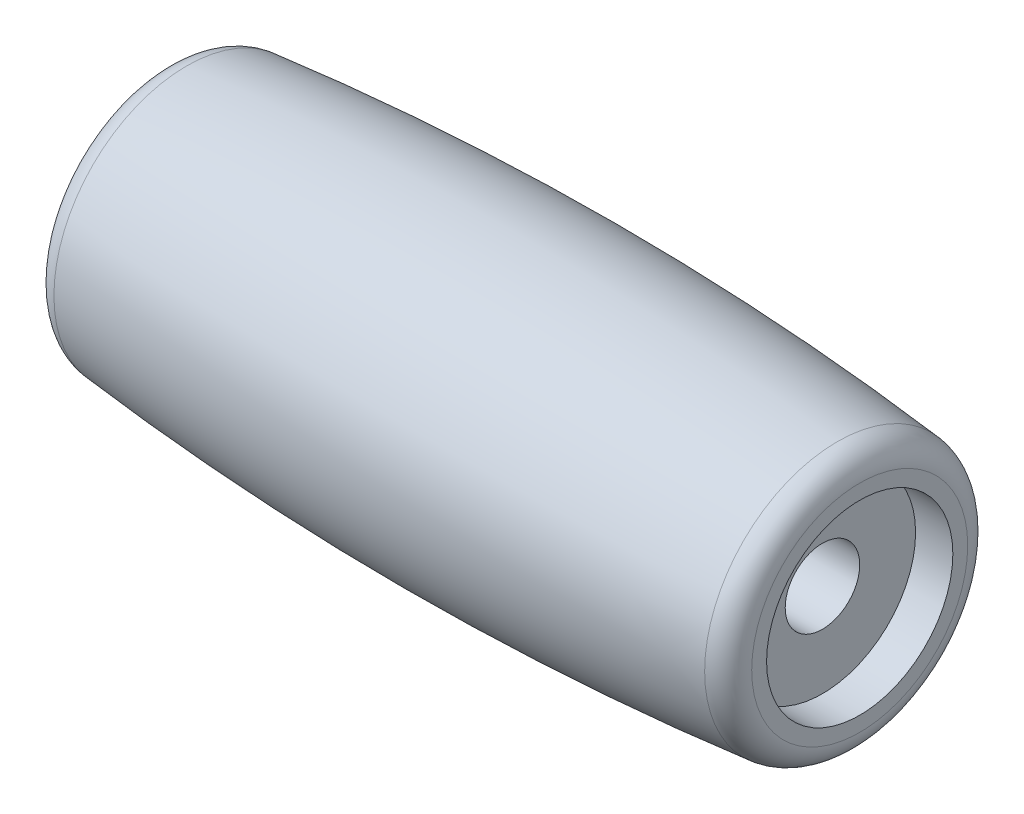
ISO-10303-21;
HEADER;
FILE_DESCRIPTION(('STEP AP214'),'2;1');
FILE_NAME('part.step','',(''),(''),'','','');
FILE_SCHEMA(('AUTOMOTIVE_DESIGN { 1 0 10303 214 1 1 1 1 }'));
ENDSEC;
DATA;
#1=APPLICATION_CONTEXT('core data for automotive mechanical design processes');
#2=APPLICATION_PROTOCOL_DEFINITION('international standard','automotive_design',2000,#1);
#3=PRODUCT_CONTEXT('',#1,'mechanical');
#4=PRODUCT('Part','Part','',(#3));
#5=PRODUCT_RELATED_PRODUCT_CATEGORY('part','',(#4));
#6=PRODUCT_DEFINITION_FORMATION('','',#4);
#7=PRODUCT_DEFINITION_CONTEXT('part definition',#1,'design');
#8=PRODUCT_DEFINITION('design','',#6,#7);
#9=PRODUCT_DEFINITION_SHAPE('','',#8);
#10=(LENGTH_UNIT() NAMED_UNIT(*) SI_UNIT(.MILLI.,.METRE.));
#11=(NAMED_UNIT(*) PLANE_ANGLE_UNIT() SI_UNIT($,.RADIAN.));
#12=(NAMED_UNIT(*) SI_UNIT($,.STERADIAN.) SOLID_ANGLE_UNIT());
#13=UNCERTAINTY_MEASURE_WITH_UNIT(LENGTH_MEASURE(1.E-05),#10,'distance_accuracy_value','');
#14=(GEOMETRIC_REPRESENTATION_CONTEXT(3) GLOBAL_UNCERTAINTY_ASSIGNED_CONTEXT((#13)) GLOBAL_UNIT_ASSIGNED_CONTEXT((#10,
#11,#12)) REPRESENTATION_CONTEXT('',''));
#15=CARTESIAN_POINT('',(0.,0.,0.));
#16=DIRECTION('',(0.,0.,1.));
#17=DIRECTION('',(1.,0.,0.));
#18=AXIS2_PLACEMENT_3D('',#15,#16,#17);
#19=CARTESIAN_POINT('',(0.,0.,0.));
#20=DIRECTION('',(-1.,0.,0.));
#21=DIRECTION('',(0.,0.,1.));
#22=AXIS2_PLACEMENT_3D('',#19,#20,#21);
#23=DEGENERATE_TOROIDAL_SURFACE('',#22,125.041666666667,131.041666666667,.F.);
#24=CARTESIAN_POINT('',(13.0999679589875,0.,0.));
#25=DIRECTION('',(-1.,0.,0.));
#26=DIRECTION('',(0.,0.,1.));
#27=AXIS2_PLACEMENT_3D('',#24,#25,#26);
#28=CIRCLE('',#27,5.34356732189234);
#29=CARTESIAN_POINT('',(13.0999679589875,0.,5.34356732189234));
#30=VERTEX_POINT('',#29);
#31=EDGE_CURVE('E66',#30,#30,#28,.T.);
#32=ORIENTED_EDGE('',*,*,#31,.T.);
#33=EDGE_LOOP('',(#32));
#34=FACE_BOUND('',#33,.T.);
#35=CARTESIAN_POINT('',(-13.0999679589875,0.,0.));
#36=DIRECTION('',(-1.,0.,0.));
#37=DIRECTION('',(0.,0.,1.));
#38=AXIS2_PLACEMENT_3D('',#35,#36,#37);
#39=CIRCLE('',#38,5.34356732189234);
#40=CARTESIAN_POINT('',(-13.0999679589875,0.,5.34356732189234));
#41=VERTEX_POINT('',#40);
#42=EDGE_CURVE('E10',#41,#41,#39,.T.);
#43=ORIENTED_EDGE('',*,*,#42,.F.);
#44=EDGE_LOOP('',(#43));
#45=FACE_BOUND('',#44,.T.);
#46=ADVANCED_FACE('F32',(#34,#45),#23,.F.);
#47=CARTESIAN_POINT('',(-13.,0.,0.));
#48=DIRECTION('',(-1.,0.,0.));
#49=DIRECTION('',(0.,0.,1.));
#50=AXIS2_PLACEMENT_3D('',#47,#48,#49);
#51=TOROIDAL_SURFACE('',#50,4.34857666506391,1.);
#52=CARTESIAN_POINT('',(-14.,0.,0.));
#53=DIRECTION('',(-1.,0.,0.));
#54=DIRECTION('',(0.,0.,1.));
#55=AXIS2_PLACEMENT_3D('',#52,#53,#54);
#56=CIRCLE('',#55,4.34857666506391);
#57=CARTESIAN_POINT('',(-14.,0.,4.34857666506391));
#58=VERTEX_POINT('',#57);
#59=EDGE_CURVE('E38',#58,#58,#56,.T.);
#60=ORIENTED_EDGE('',*,*,#59,.F.);
#61=EDGE_LOOP('',(#60));
#62=FACE_BOUND('',#61,.T.);
#63=ORIENTED_EDGE('',*,*,#42,.T.);
#64=EDGE_LOOP('',(#63));
#65=FACE_BOUND('',#64,.T.);
#66=ADVANCED_FACE('F96',(#62,#65),#51,.T.);
#67=CARTESIAN_POINT('',(-14.,0.,0.));
#68=DIRECTION('',(-1.,0.,0.));
#69=DIRECTION('',(0.,0.,1.));
#70=AXIS2_PLACEMENT_3D('',#67,#68,#69);
#71=PLANE('',#70);
#72=ORIENTED_EDGE('',*,*,#59,.T.);
#73=EDGE_LOOP('',(#72));
#74=FACE_BOUND('',#73,.T.);
#75=CARTESIAN_POINT('',(-14.,0.,0.));
#76=DIRECTION('',(-1.,0.,0.));
#77=DIRECTION('',(0.,0.,1.));
#78=AXIS2_PLACEMENT_3D('',#75,#76,#77);
#79=CIRCLE('',#78,3.75);
#80=CARTESIAN_POINT('',(-14.,0.,3.75));
#81=VERTEX_POINT('',#80);
#82=EDGE_CURVE('E42',#81,#81,#79,.T.);
#83=ORIENTED_EDGE('',*,*,#82,.F.);
#84=EDGE_LOOP('',(#83));
#85=FACE_BOUND('',#84,.T.);
#86=ADVANCED_FACE('F100',(#74,#85),#71,.T.);
#87=CARTESIAN_POINT('',(-14.,0.,0.));
#88=DIRECTION('',(-1.,0.,0.));
#89=DIRECTION('',(0.,0.,1.));
#90=AXIS2_PLACEMENT_3D('',#87,#88,#89);
#91=CYLINDRICAL_SURFACE('',#90,3.75);
#92=CARTESIAN_POINT('',(-12.5,0.,0.));
#93=DIRECTION('',(-1.,0.,0.));
#94=DIRECTION('',(0.,0.,1.));
#95=AXIS2_PLACEMENT_3D('',#92,#93,#94);
#96=CIRCLE('',#95,3.75);
#97=CARTESIAN_POINT('',(-12.5,0.,3.75));
#98=VERTEX_POINT('',#97);
#99=EDGE_CURVE('E46',#98,#98,#96,.T.);
#100=ORIENTED_EDGE('',*,*,#99,.F.);
#101=EDGE_LOOP('',(#100));
#102=FACE_BOUND('',#101,.T.);
#103=ORIENTED_EDGE('',*,*,#82,.T.);
#104=EDGE_LOOP('',(#103));
#105=FACE_BOUND('',#104,.T.);
#106=ADVANCED_FACE('F105',(#102,#105),#91,.F.);
#107=CARTESIAN_POINT('',(-12.5,0.,0.));
#108=DIRECTION('',(1.,0.,0.));
#109=DIRECTION('',(0.,0.,-1.));
#110=AXIS2_PLACEMENT_3D('',#107,#108,#109);
#111=PLANE('',#110);
#112=CARTESIAN_POINT('',(-12.5,0.,0.));
#113=DIRECTION('',(-1.,0.,0.));
#114=DIRECTION('',(0.,0.,1.));
#115=AXIS2_PLACEMENT_3D('',#112,#113,#114);
#116=CIRCLE('',#115,1.5);
#117=CARTESIAN_POINT('',(-12.5,0.,1.5));
#118=VERTEX_POINT('',#117);
#119=EDGE_CURVE('E51',#118,#118,#116,.T.);
#120=ORIENTED_EDGE('',*,*,#119,.F.);
#121=EDGE_LOOP('',(#120));
#122=FACE_BOUND('',#121,.T.);
#123=ORIENTED_EDGE('',*,*,#99,.T.);
#124=EDGE_LOOP('',(#123));
#125=FACE_BOUND('',#124,.T.);
#126=ADVANCED_FACE('F110',(#122,#125),#111,.F.);
#127=CARTESIAN_POINT('',(-14.,0.,0.));
#128=DIRECTION('',(-1.,0.,0.));
#129=DIRECTION('',(0.,0.,1.));
#130=AXIS2_PLACEMENT_3D('',#127,#128,#129);
#131=CYLINDRICAL_SURFACE('',#130,1.5);
#132=CARTESIAN_POINT('',(12.5,0.,0.));
#133=DIRECTION('',(-1.,0.,0.));
#134=DIRECTION('',(0.,0.,1.));
#135=AXIS2_PLACEMENT_3D('',#132,#133,#134);
#136=CIRCLE('',#135,1.5);
#137=CARTESIAN_POINT('',(12.5,0.,1.5));
#138=VERTEX_POINT('',#137);
#139=EDGE_CURVE('E54',#138,#138,#136,.T.);
#140=ORIENTED_EDGE('',*,*,#139,.F.);
#141=EDGE_LOOP('',(#140));
#142=FACE_BOUND('',#141,.T.);
#143=ORIENTED_EDGE('',*,*,#119,.T.);
#144=EDGE_LOOP('',(#143));
#145=FACE_BOUND('',#144,.T.);
#146=ADVANCED_FACE('F92',(#142,#145),#131,.F.);
#147=CARTESIAN_POINT('',(12.5,0.,0.));
#148=DIRECTION('',(1.,0.,0.));
#149=DIRECTION('',(0.,0.,-1.));
#150=AXIS2_PLACEMENT_3D('',#147,#148,#149);
#151=PLANE('',#150);
#152=ORIENTED_EDGE('',*,*,#139,.T.);
#153=EDGE_LOOP('',(#152));
#154=FACE_BOUND('',#153,.T.);
#155=CARTESIAN_POINT('',(12.5,0.,0.));
#156=DIRECTION('',(-1.,0.,0.));
#157=DIRECTION('',(0.,0.,1.));
#158=AXIS2_PLACEMENT_3D('',#155,#156,#157);
#159=CIRCLE('',#158,3.75);
#160=CARTESIAN_POINT('',(12.5,0.,3.75));
#161=VERTEX_POINT('',#160);
#162=EDGE_CURVE('E57',#161,#161,#159,.T.);
#163=ORIENTED_EDGE('',*,*,#162,.F.);
#164=EDGE_LOOP('',(#163));
#165=FACE_BOUND('',#164,.T.);
#166=ADVANCED_FACE('F86',(#154,#165),#151,.T.);
#167=CARTESIAN_POINT('',(-14.,0.,0.));
#168=DIRECTION('',(-1.,0.,0.));
#169=DIRECTION('',(0.,0.,1.));
#170=AXIS2_PLACEMENT_3D('',#167,#168,#169);
#171=CYLINDRICAL_SURFACE('',#170,3.75);
#172=ORIENTED_EDGE('',*,*,#162,.T.);
#173=EDGE_LOOP('',(#172));
#174=FACE_BOUND('',#173,.T.);
#175=CARTESIAN_POINT('',(14.,0.,0.));
#176=DIRECTION('',(-1.,0.,0.));
#177=DIRECTION('',(0.,0.,1.));
#178=AXIS2_PLACEMENT_3D('',#175,#176,#177);
#179=CIRCLE('',#178,3.75);
#180=CARTESIAN_POINT('',(14.,0.,3.75));
#181=VERTEX_POINT('',#180);
#182=EDGE_CURVE('E60',#181,#181,#179,.T.);
#183=ORIENTED_EDGE('',*,*,#182,.F.);
#184=EDGE_LOOP('',(#183));
#185=FACE_BOUND('',#184,.T.);
#186=ADVANCED_FACE('F81',(#174,#185),#171,.F.);
#187=CARTESIAN_POINT('',(14.,0.,0.));
#188=DIRECTION('',(-1.,0.,0.));
#189=DIRECTION('',(0.,0.,1.));
#190=AXIS2_PLACEMENT_3D('',#187,#188,#189);
#191=PLANE('',#190);
#192=CARTESIAN_POINT('',(14.,0.,0.));
#193=DIRECTION('',(-1.,0.,0.));
#194=DIRECTION('',(0.,0.,1.));
#195=AXIS2_PLACEMENT_3D('',#192,#193,#194);
#196=CIRCLE('',#195,4.34857666506391);
#197=CARTESIAN_POINT('',(14.,0.,4.34857666506391));
#198=VERTEX_POINT('',#197);
#199=EDGE_CURVE('E63',#198,#198,#196,.T.);
#200=ORIENTED_EDGE('',*,*,#199,.F.);
#201=EDGE_LOOP('',(#200));
#202=FACE_BOUND('',#201,.T.);
#203=ORIENTED_EDGE('',*,*,#182,.T.);
#204=EDGE_LOOP('',(#203));
#205=FACE_BOUND('',#204,.T.);
#206=ADVANCED_FACE('F75',(#202,#205),#191,.F.);
#207=CARTESIAN_POINT('',(13.,0.,0.));
#208=DIRECTION('',(-1.,0.,0.));
#209=DIRECTION('',(0.,0.,1.));
#210=AXIS2_PLACEMENT_3D('',#207,#208,#209);
#211=TOROIDAL_SURFACE('',#210,4.34857666506391,1.);
#212=ORIENTED_EDGE('',*,*,#31,.F.);
#213=EDGE_LOOP('',(#212));
#214=FACE_BOUND('',#213,.T.);
#215=ORIENTED_EDGE('',*,*,#199,.T.);
#216=EDGE_LOOP('',(#215));
#217=FACE_BOUND('',#216,.T.);
#218=ADVANCED_FACE('F72',(#214,#217),#211,.T.);
#219=CLOSED_SHELL('',(#46,#66,#86,#106,#126,#146,#166,#186,#206,#218));
#220=MANIFOLD_SOLID_BREP('B2',#219);
#221=ADVANCED_BREP_SHAPE_REPRESENTATION('',(#18,#220),#14);
#222=SHAPE_DEFINITION_REPRESENTATION(#9,#221);
ENDSEC;
END-ISO-10303-21;
